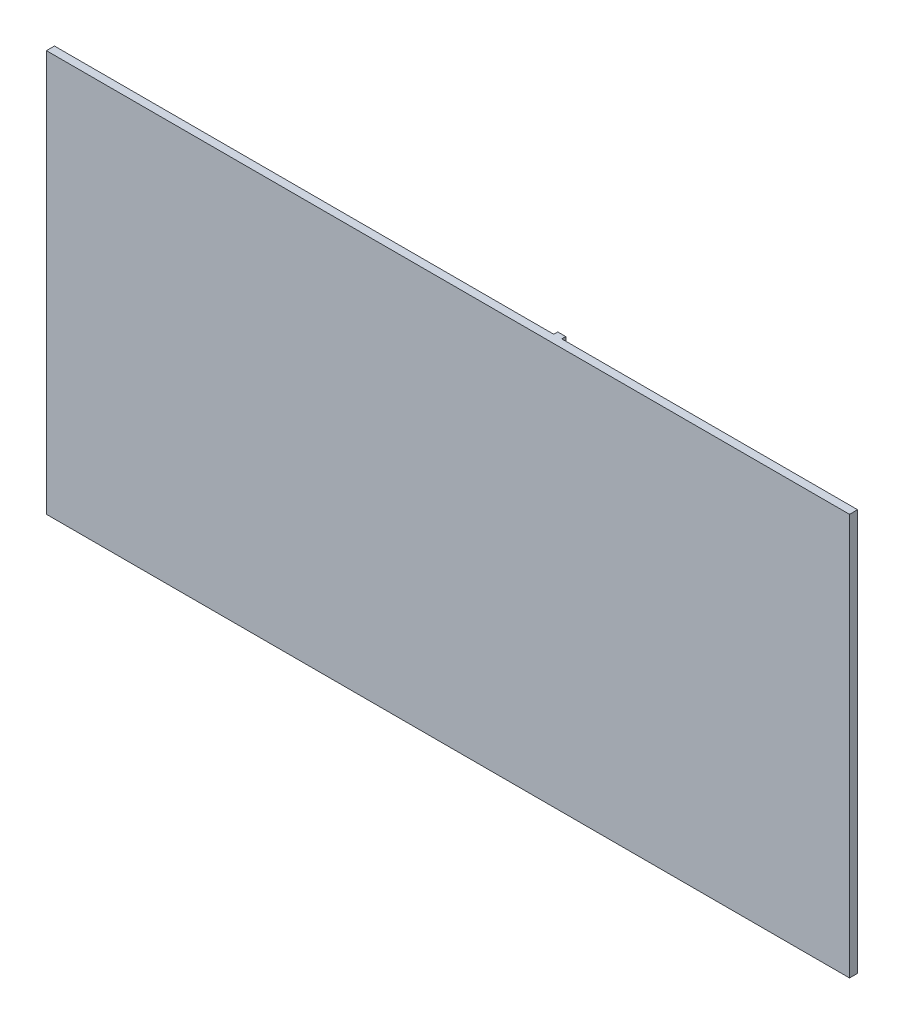
ISO-10303-21;
HEADER;
FILE_DESCRIPTION(('STEP AP214'),'2;1');
FILE_NAME('part.step','',(''),(''),'','','');
FILE_SCHEMA(('AUTOMOTIVE_DESIGN { 1 0 10303 214 1 1 1 1 }'));
ENDSEC;
DATA;
#1=APPLICATION_CONTEXT('core data for automotive mechanical design processes');
#2=APPLICATION_PROTOCOL_DEFINITION('international standard','automotive_design',2000,#1);
#3=PRODUCT_CONTEXT('',#1,'mechanical');
#4=PRODUCT('Part','Part','',(#3));
#5=PRODUCT_RELATED_PRODUCT_CATEGORY('part','',(#4));
#6=PRODUCT_DEFINITION_FORMATION('','',#4);
#7=PRODUCT_DEFINITION_CONTEXT('part definition',#1,'design');
#8=PRODUCT_DEFINITION('design','',#6,#7);
#9=PRODUCT_DEFINITION_SHAPE('','',#8);
#10=(LENGTH_UNIT() NAMED_UNIT(*) SI_UNIT(.MILLI.,.METRE.));
#11=(NAMED_UNIT(*) PLANE_ANGLE_UNIT() SI_UNIT($,.RADIAN.));
#12=(NAMED_UNIT(*) SI_UNIT($,.STERADIAN.) SOLID_ANGLE_UNIT());
#13=UNCERTAINTY_MEASURE_WITH_UNIT(LENGTH_MEASURE(1.E-05),#10,'distance_accuracy_value','');
#14=(GEOMETRIC_REPRESENTATION_CONTEXT(3) GLOBAL_UNCERTAINTY_ASSIGNED_CONTEXT((#13)) GLOBAL_UNIT_ASSIGNED_CONTEXT((#10,
#11,#12)) REPRESENTATION_CONTEXT('',''));
#15=CARTESIAN_POINT('',(0.,0.,0.));
#16=DIRECTION('',(0.,0.,1.));
#17=DIRECTION('',(1.,0.,0.));
#18=AXIS2_PLACEMENT_3D('',#15,#16,#17);
#19=CARTESIAN_POINT('',(0.,0.,0.));
#20=DIRECTION('',(0.,0.,1.));
#21=DIRECTION('',(1.,0.,0.));
#22=AXIS2_PLACEMENT_3D('',#19,#20,#21);
#23=PLANE('',#22);
#24=DIRECTION('',(0.,-1.,0.));
#25=VECTOR('',#24,1.);
#26=CARTESIAN_POINT('',(131.636020436632,250.,0.));
#27=LINE('',#26,#25);
#28=CARTESIAN_POINT('',(131.636020436632,250.,0.));
#29=VERTEX_POINT('',#28);
#30=CARTESIAN_POINT('',(131.636020436632,-250.,0.));
#31=VERTEX_POINT('',#30);
#32=EDGE_CURVE('E54',#29,#31,#27,.T.);
#33=ORIENTED_EDGE('',*,*,#32,.F.);
#34=DIRECTION('',(-1.,0.,0.));
#35=VECTOR('',#34,1.);
#36=CARTESIAN_POINT('',(-500.,250.,0.));
#37=LINE('',#36,#35);
#38=CARTESIAN_POINT('',(500.,250.,0.));
#39=VERTEX_POINT('',#38);
#40=EDGE_CURVE('E145',#39,#29,#37,.T.);
#41=ORIENTED_EDGE('',*,*,#40,.F.);
#42=DIRECTION('',(0.,1.,0.));
#43=VECTOR('',#42,1.);
#44=CARTESIAN_POINT('',(500.,250.,0.));
#45=LINE('',#44,#43);
#46=CARTESIAN_POINT('',(500.,-250.,0.));
#47=VERTEX_POINT('',#46);
#48=EDGE_CURVE('E125',#47,#39,#45,.T.);
#49=ORIENTED_EDGE('',*,*,#48,.F.);
#50=DIRECTION('',(1.,0.,0.));
#51=VECTOR('',#50,1.);
#52=CARTESIAN_POINT('',(-500.,-250.,0.));
#53=LINE('',#52,#51);
#54=EDGE_CURVE('E59',#31,#47,#53,.T.);
#55=ORIENTED_EDGE('',*,*,#54,.F.);
#56=EDGE_LOOP('',(#33,#41,#49,#55));
#57=FACE_BOUND('',#56,.T.);
#58=ADVANCED_FACE('F39',(#57),#23,.F.);
#59=DIRECTION('',(0.,1.,0.));
#60=VECTOR('',#59,1.);
#61=CARTESIAN_POINT('',(121.636020436633,250.,0.));
#62=LINE('',#61,#60);
#63=CARTESIAN_POINT('',(121.636020436632,-250.,0.));
#64=VERTEX_POINT('',#63);
#65=CARTESIAN_POINT('',(121.636020436633,250.,0.));
#66=VERTEX_POINT('',#65);
#67=EDGE_CURVE('E122',#64,#66,#62,.T.);
#68=ORIENTED_EDGE('',*,*,#67,.F.);
#69=CARTESIAN_POINT('',(-500.,-250.,0.));
#70=VERTEX_POINT('',#69);
#71=EDGE_CURVE('E138',#70,#64,#53,.T.);
#72=ORIENTED_EDGE('',*,*,#71,.F.);
#73=DIRECTION('',(0.,-1.,0.));
#74=VECTOR('',#73,1.);
#75=CARTESIAN_POINT('',(-500.,250.,0.));
#76=LINE('',#75,#74);
#77=CARTESIAN_POINT('',(-500.,250.,0.));
#78=VERTEX_POINT('',#77);
#79=EDGE_CURVE('E147',#78,#70,#76,.T.);
#80=ORIENTED_EDGE('',*,*,#79,.F.);
#81=EDGE_CURVE('E128',#66,#78,#37,.T.);
#82=ORIENTED_EDGE('',*,*,#81,.F.);
#83=EDGE_LOOP('',(#68,#72,#80,#82));
#84=FACE_BOUND('',#83,.T.);
#85=ADVANCED_FACE('F164',(#84),#23,.F.);
#86=CARTESIAN_POINT('',(500.,250.,10.));
#87=DIRECTION('',(-1.,0.,0.));
#88=DIRECTION('',(0.,-1.,0.));
#89=AXIS2_PLACEMENT_3D('',#86,#87,#88);
#90=PLANE('',#89);
#91=ORIENTED_EDGE('',*,*,#48,.T.);
#92=DIRECTION('',(0.,0.,-1.));
#93=VECTOR('',#92,1.);
#94=CARTESIAN_POINT('',(500.,250.,10.));
#95=LINE('',#94,#93);
#96=CARTESIAN_POINT('',(500.,250.,10.));
#97=VERTEX_POINT('',#96);
#98=EDGE_CURVE('E11',#97,#39,#95,.T.);
#99=ORIENTED_EDGE('',*,*,#98,.F.);
#100=DIRECTION('',(0.,1.,0.));
#101=VECTOR('',#100,1.);
#102=CARTESIAN_POINT('',(500.,250.,10.));
#103=LINE('',#102,#101);
#104=CARTESIAN_POINT('',(500.,-250.,10.));
#105=VERTEX_POINT('',#104);
#106=EDGE_CURVE('E134',#105,#97,#103,.T.);
#107=ORIENTED_EDGE('',*,*,#106,.F.);
#108=DIRECTION('',(0.,0.,-1.));
#109=VECTOR('',#108,1.);
#110=CARTESIAN_POINT('',(500.,-250.,10.));
#111=LINE('',#110,#109);
#112=EDGE_CURVE('E143',#105,#47,#111,.T.);
#113=ORIENTED_EDGE('',*,*,#112,.T.);
#114=EDGE_LOOP('',(#91,#99,#107,#113));
#115=FACE_BOUND('',#114,.T.);
#116=ADVANCED_FACE('F41',(#115),#90,.F.);
#117=CARTESIAN_POINT('',(-500.,250.,10.));
#118=DIRECTION('',(0.,-1.,0.));
#119=DIRECTION('',(0.,0.,-1.));
#120=AXIS2_PLACEMENT_3D('',#117,#118,#119);
#121=PLANE('',#120);
#122=ORIENTED_EDGE('',*,*,#40,.T.);
#123=DIRECTION('',(0.,0.,1.));
#124=VECTOR('',#123,1.);
#125=CARTESIAN_POINT('',(131.636020436632,250.,-5.));
#126=LINE('',#125,#124);
#127=CARTESIAN_POINT('',(131.636020436632,250.,-5.));
#128=VERTEX_POINT('',#127);
#129=EDGE_CURVE('E172',#128,#29,#126,.T.);
#130=ORIENTED_EDGE('',*,*,#129,.F.);
#131=DIRECTION('',(1.,0.,0.));
#132=VECTOR('',#131,1.);
#133=CARTESIAN_POINT('',(131.636020436632,250.,-5.));
#134=LINE('',#133,#132);
#135=CARTESIAN_POINT('',(121.636020436633,250.,-5.));
#136=VERTEX_POINT('',#135);
#137=EDGE_CURVE('E118',#136,#128,#134,.T.);
#138=ORIENTED_EDGE('',*,*,#137,.F.);
#139=DIRECTION('',(0.,0.,1.));
#140=VECTOR('',#139,1.);
#141=CARTESIAN_POINT('',(121.636020436633,250.,-5.));
#142=LINE('',#141,#140);
#143=EDGE_CURVE('E130',#136,#66,#142,.T.);
#144=ORIENTED_EDGE('',*,*,#143,.T.);
#145=ORIENTED_EDGE('',*,*,#81,.T.);
#146=DIRECTION('',(0.,0.,-1.));
#147=VECTOR('',#146,1.);
#148=CARTESIAN_POINT('',(-500.,250.,10.));
#149=LINE('',#148,#147);
#150=CARTESIAN_POINT('',(-500.,250.,10.));
#151=VERTEX_POINT('',#150);
#152=EDGE_CURVE('E47',#151,#78,#149,.T.);
#153=ORIENTED_EDGE('',*,*,#152,.F.);
#154=DIRECTION('',(-1.,0.,0.));
#155=VECTOR('',#154,1.);
#156=CARTESIAN_POINT('',(-500.,250.,10.));
#157=LINE('',#156,#155);
#158=EDGE_CURVE('E137',#97,#151,#157,.T.);
#159=ORIENTED_EDGE('',*,*,#158,.F.);
#160=ORIENTED_EDGE('',*,*,#98,.T.);
#161=EDGE_LOOP('',(#122,#130,#138,#144,#145,#153,#159,#160));
#162=FACE_BOUND('',#161,.T.);
#163=ADVANCED_FACE('F177',(#162),#121,.F.);
#164=CARTESIAN_POINT('',(-500.,250.,10.));
#165=DIRECTION('',(1.,0.,0.));
#166=DIRECTION('',(0.,0.,-1.));
#167=AXIS2_PLACEMENT_3D('',#164,#165,#166);
#168=PLANE('',#167);
#169=ORIENTED_EDGE('',*,*,#79,.T.);
#170=DIRECTION('',(0.,0.,-1.));
#171=VECTOR('',#170,1.);
#172=CARTESIAN_POINT('',(-500.,-250.,10.));
#173=LINE('',#172,#171);
#174=CARTESIAN_POINT('',(-500.,-250.,10.));
#175=VERTEX_POINT('',#174);
#176=EDGE_CURVE('E152',#175,#70,#173,.T.);
#177=ORIENTED_EDGE('',*,*,#176,.F.);
#178=DIRECTION('',(0.,-1.,0.));
#179=VECTOR('',#178,1.);
#180=CARTESIAN_POINT('',(-500.,250.,10.));
#181=LINE('',#180,#179);
#182=EDGE_CURVE('E140',#151,#175,#181,.T.);
#183=ORIENTED_EDGE('',*,*,#182,.F.);
#184=ORIENTED_EDGE('',*,*,#152,.T.);
#185=EDGE_LOOP('',(#169,#177,#183,#184));
#186=FACE_BOUND('',#185,.T.);
#187=ADVANCED_FACE('F159',(#186),#168,.F.);
#188=CARTESIAN_POINT('',(-500.,-250.,10.));
#189=DIRECTION('',(0.,1.,0.));
#190=DIRECTION('',(0.,0.,1.));
#191=AXIS2_PLACEMENT_3D('',#188,#189,#190);
#192=PLANE('',#191);
#193=ORIENTED_EDGE('',*,*,#71,.T.);
#194=DIRECTION('',(0.,0.,1.));
#195=VECTOR('',#194,1.);
#196=CARTESIAN_POINT('',(121.636020436632,-250.,-5.));
#197=LINE('',#196,#195);
#198=CARTESIAN_POINT('',(121.636020436632,-250.,-5.));
#199=VERTEX_POINT('',#198);
#200=EDGE_CURVE('E109',#199,#64,#197,.T.);
#201=ORIENTED_EDGE('',*,*,#200,.F.);
#202=DIRECTION('',(-1.,0.,0.));
#203=VECTOR('',#202,1.);
#204=CARTESIAN_POINT('',(131.636020436632,-250.,-5.));
#205=LINE('',#204,#203);
#206=CARTESIAN_POINT('',(131.636020436632,-250.,-5.));
#207=VERTEX_POINT('',#206);
#208=EDGE_CURVE('E102',#207,#199,#205,.T.);
#209=ORIENTED_EDGE('',*,*,#208,.F.);
#210=DIRECTION('',(0.,0.,1.));
#211=VECTOR('',#210,1.);
#212=CARTESIAN_POINT('',(131.636020436632,-250.,-5.));
#213=LINE('',#212,#211);
#214=EDGE_CURVE('E107',#207,#31,#213,.T.);
#215=ORIENTED_EDGE('',*,*,#214,.T.);
#216=ORIENTED_EDGE('',*,*,#54,.T.);
#217=ORIENTED_EDGE('',*,*,#112,.F.);
#218=DIRECTION('',(1.,0.,0.));
#219=VECTOR('',#218,1.);
#220=CARTESIAN_POINT('',(-500.,-250.,10.));
#221=LINE('',#220,#219);
#222=EDGE_CURVE('E142',#175,#105,#221,.T.);
#223=ORIENTED_EDGE('',*,*,#222,.F.);
#224=ORIENTED_EDGE('',*,*,#176,.T.);
#225=EDGE_LOOP('',(#193,#201,#209,#215,#216,#217,#223,#224));
#226=FACE_BOUND('',#225,.T.);
#227=ADVANCED_FACE('F105',(#226),#192,.F.);
#228=CARTESIAN_POINT('',(0.,0.,10.));
#229=DIRECTION('',(0.,0.,1.));
#230=DIRECTION('',(1.,0.,0.));
#231=AXIS2_PLACEMENT_3D('',#228,#229,#230);
#232=PLANE('',#231);
#233=ORIENTED_EDGE('',*,*,#106,.T.);
#234=ORIENTED_EDGE('',*,*,#158,.T.);
#235=ORIENTED_EDGE('',*,*,#182,.T.);
#236=ORIENTED_EDGE('',*,*,#222,.T.);
#237=EDGE_LOOP('',(#233,#234,#235,#236));
#238=FACE_BOUND('',#237,.T.);
#239=ADVANCED_FACE('F183',(#238),#232,.T.);
#240=CARTESIAN_POINT('',(131.636020436632,250.,-5.));
#241=DIRECTION('',(-1.,0.,0.));
#242=DIRECTION('',(0.,0.,1.));
#243=AXIS2_PLACEMENT_3D('',#240,#241,#242);
#244=PLANE('',#243);
#245=ORIENTED_EDGE('',*,*,#32,.T.);
#246=ORIENTED_EDGE('',*,*,#214,.F.);
#247=DIRECTION('',(0.,-1.,0.));
#248=VECTOR('',#247,1.);
#249=CARTESIAN_POINT('',(131.636020436632,250.,-5.));
#250=LINE('',#249,#248);
#251=EDGE_CURVE('E113',#128,#207,#250,.T.);
#252=ORIENTED_EDGE('',*,*,#251,.F.);
#253=ORIENTED_EDGE('',*,*,#129,.T.);
#254=EDGE_LOOP('',(#245,#246,#252,#253));
#255=FACE_BOUND('',#254,.T.);
#256=ADVANCED_FACE('F124',(#255),#244,.F.);
#257=CARTESIAN_POINT('',(121.636020436633,250.,-5.));
#258=DIRECTION('',(1.,0.,0.));
#259=DIRECTION('',(0.,1.,0.));
#260=AXIS2_PLACEMENT_3D('',#257,#258,#259);
#261=PLANE('',#260);
#262=ORIENTED_EDGE('',*,*,#67,.T.);
#263=ORIENTED_EDGE('',*,*,#143,.F.);
#264=DIRECTION('',(0.,1.,0.));
#265=VECTOR('',#264,1.);
#266=CARTESIAN_POINT('',(121.636020436633,250.,-5.));
#267=LINE('',#266,#265);
#268=EDGE_CURVE('E112',#199,#136,#267,.T.);
#269=ORIENTED_EDGE('',*,*,#268,.F.);
#270=ORIENTED_EDGE('',*,*,#200,.T.);
#271=EDGE_LOOP('',(#262,#263,#269,#270));
#272=FACE_BOUND('',#271,.T.);
#273=ADVANCED_FACE('F168',(#272),#261,.F.);
#274=CARTESIAN_POINT('',(0.,0.,-5.));
#275=DIRECTION('',(0.,0.,-1.));
#276=DIRECTION('',(-1.,0.,0.));
#277=AXIS2_PLACEMENT_3D('',#274,#275,#276);
#278=PLANE('',#277);
#279=ORIENTED_EDGE('',*,*,#251,.T.);
#280=ORIENTED_EDGE('',*,*,#208,.T.);
#281=ORIENTED_EDGE('',*,*,#268,.T.);
#282=ORIENTED_EDGE('',*,*,#137,.T.);
#283=EDGE_LOOP('',(#279,#280,#281,#282));
#284=FACE_BOUND('',#283,.T.);
#285=ADVANCED_FACE('F116',(#284),#278,.T.);
#286=CLOSED_SHELL('',(#58,#85,#116,#163,#187,#227,#239,#256,#273,#285));
#287=MANIFOLD_SOLID_BREP('B2',#286);
#288=ADVANCED_BREP_SHAPE_REPRESENTATION('',(#18,#287),#14);
#289=SHAPE_DEFINITION_REPRESENTATION(#9,#288);
ENDSEC;
END-ISO-10303-21;
